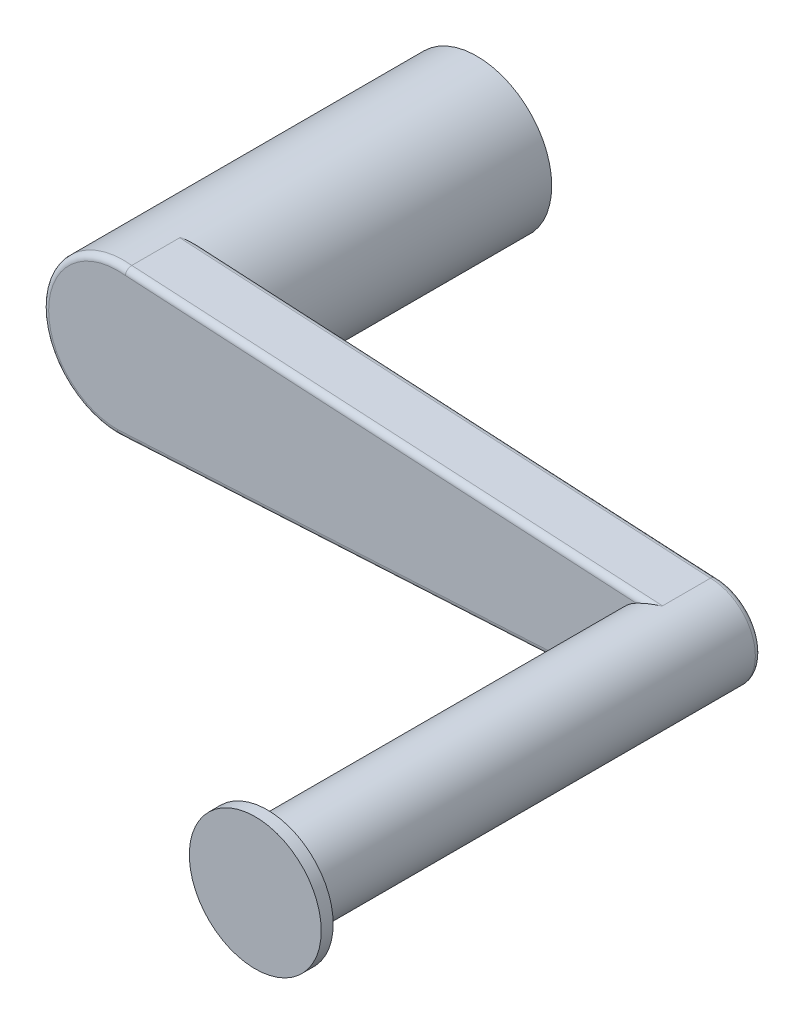
ISO-10303-21;
HEADER;
FILE_DESCRIPTION(('STEP AP214'),'2;1');
FILE_NAME('part.step','',(''),(''),'','','');
FILE_SCHEMA(('AUTOMOTIVE_DESIGN { 1 0 10303 214 1 1 1 1 }'));
ENDSEC;
DATA;
#1=APPLICATION_CONTEXT('core data for automotive mechanical design processes');
#2=APPLICATION_PROTOCOL_DEFINITION('international standard','automotive_design',2000,#1);
#3=PRODUCT_CONTEXT('',#1,'mechanical');
#4=PRODUCT('Part','Part','',(#3));
#5=PRODUCT_RELATED_PRODUCT_CATEGORY('part','',(#4));
#6=PRODUCT_DEFINITION_FORMATION('','',#4);
#7=PRODUCT_DEFINITION_CONTEXT('part definition',#1,'design');
#8=PRODUCT_DEFINITION('design','',#6,#7);
#9=PRODUCT_DEFINITION_SHAPE('','',#8);
#10=(LENGTH_UNIT() NAMED_UNIT(*) SI_UNIT(.MILLI.,.METRE.));
#11=(NAMED_UNIT(*) PLANE_ANGLE_UNIT() SI_UNIT($,.RADIAN.));
#12=(NAMED_UNIT(*) SI_UNIT($,.STERADIAN.) SOLID_ANGLE_UNIT());
#13=UNCERTAINTY_MEASURE_WITH_UNIT(LENGTH_MEASURE(1.E-05),#10,'distance_accuracy_value','');
#14=(GEOMETRIC_REPRESENTATION_CONTEXT(3) GLOBAL_UNCERTAINTY_ASSIGNED_CONTEXT((#13)) GLOBAL_UNIT_ASSIGNED_CONTEXT((#10,
#11,#12)) REPRESENTATION_CONTEXT('',''));
#15=CARTESIAN_POINT('',(0.,0.,0.));
#16=DIRECTION('',(0.,0.,1.));
#17=DIRECTION('',(1.,0.,0.));
#18=AXIS2_PLACEMENT_3D('',#15,#16,#17);
#19=CARTESIAN_POINT('',(0.,0.,100.));
#20=DIRECTION('',(0.,0.,-1.));
#21=DIRECTION('',(-1.,0.,0.));
#22=AXIS2_PLACEMENT_3D('',#19,#20,#21);
#23=CYLINDRICAL_SURFACE('',#22,25.);
#24=DIRECTION('',(0.,0.,-1.));
#25=VECTOR('',#24,1.);
#26=CARTESIAN_POINT('',(1.73255507163184E-13,-25.,120.));
#27=LINE('',#26,#25);
#28=CARTESIAN_POINT('',(1.73255507163184E-13,-25.,118.));
#29=VERTEX_POINT('',#28);
#30=CARTESIAN_POINT('',(1.73255507163184E-13,-25.,100.));
#31=VERTEX_POINT('',#30);
#32=EDGE_CURVE('E117',#29,#31,#27,.T.);
#33=ORIENTED_EDGE('',*,*,#32,.F.);
#34=CARTESIAN_POINT('',(0.,0.,118.));
#35=DIRECTION('',(0.,0.,1.));
#36=DIRECTION('',(1.,0.,0.));
#37=AXIS2_PLACEMENT_3D('',#34,#35,#36);
#38=CIRCLE('',#37,25.);
#39=CARTESIAN_POINT('',(2.7692307692306,24.8461538461539,118.));
#40=VERTEX_POINT('',#39);
#41=EDGE_CURVE('E166',#29,#40,#38,.F.);
#42=ORIENTED_EDGE('',*,*,#41,.T.);
#43=DIRECTION('',(0.,0.,-1.));
#44=VECTOR('',#43,1.);
#45=CARTESIAN_POINT('',(2.7692307692306,24.8461538461539,120.));
#46=LINE('',#45,#44);
#47=CARTESIAN_POINT('',(2.7692307692306,24.8461538461539,102.));
#48=VERTEX_POINT('',#47);
#49=EDGE_CURVE('E126',#40,#48,#46,.T.);
#50=ORIENTED_EDGE('',*,*,#49,.T.);
#51=CARTESIAN_POINT('',(2.7692307692306,24.8461538461539,102.));
#52=CARTESIAN_POINT('',(2.76920657867717,24.8461564574948,101.992857759211));
#53=CARTESIAN_POINT('',(2.76991520750156,24.846077567389,101.985751282102));
#54=CARTESIAN_POINT('',(2.77256276734933,24.8457823079611,101.97188491719));
#55=CARTESIAN_POINT('',(2.77448215644942,24.8455681222639,101.965121334546));
#56=CARTESIAN_POINT('',(2.78014832622034,24.8449347980058,101.949758748725));
#57=CARTESIAN_POINT('',(2.78429358711249,24.8444708433903,101.941312592113));
#58=CARTESIAN_POINT('',(2.79384302701979,24.8433988225037,101.92512709527));
#59=CARTESIAN_POINT('',(2.7992560446564,24.8427897439061,101.917393274576));
#60=CARTESIAN_POINT('',(2.81916410965812,24.8405416408512,101.892045464215));
#61=CARTESIAN_POINT('',(2.8356213982872,24.8386704011619,101.876033411479));
#62=CARTESIAN_POINT('',(2.87049439960146,24.8346649271049,101.846380759646));
#63=CARTESIAN_POINT('',(2.88892127405317,24.8325291816306,101.832754971069));
#64=CARTESIAN_POINT('',(2.94634540055127,24.825803788839,101.79367470635));
#65=CARTESIAN_POINT('',(2.98689660056892,24.8209618884444,101.770571087999));
#66=CARTESIAN_POINT('',(3.06951625726153,24.8108813522948,101.72730993134));
#67=CARTESIAN_POINT('',(3.11158900110526,24.8056415409024,101.70716168297));
#68=CARTESIAN_POINT('',(3.19662461994925,24.7948266110932,101.668659797212));
#69=CARTESIAN_POINT('',(3.23958919681258,24.7892508036696,101.650310065199));
#70=CARTESIAN_POINT('',(3.32590321107761,24.7778179964169,101.614857472116));
#71=CARTESIAN_POINT('',(3.36925195934672,24.7719614397029,101.597752746933));
#72=CARTESIAN_POINT('',(3.49887216629378,24.7540995164109,101.548048991225));
#73=CARTESIAN_POINT('',(3.58556634161329,24.7416941452258,101.516696951772));
#74=CARTESIAN_POINT('',(3.75949821276058,24.7158636866898,101.455973620081));
#75=CARTESIAN_POINT('',(3.84673600661378,24.7024384102401,101.426602697074));
#76=CARTESIAN_POINT('',(4.10904207242345,24.6606391854036,101.340463958842));
#77=CARTESIAN_POINT('',(4.28454023665348,24.6307642082866,101.28572905875));
#78=CARTESIAN_POINT('',(4.6352359152364,24.5671787724438,101.179776125138));
#79=CARTESIAN_POINT('',(4.81043251503152,24.5334812750937,101.128547098498));
#80=CARTESIAN_POINT('',(5.16076636724421,24.462183766347,101.028826845169));
#81=CARTESIAN_POINT('',(5.33590362417317,24.4245846291087,100.980335008959));
#82=CARTESIAN_POINT('',(5.74914689913024,24.3311929748444,100.868827482744));
#83=CARTESIAN_POINT('',(5.98716803800244,24.2737315528299,100.806885778224));
#84=CARTESIAN_POINT('',(6.46256018223369,24.1515125585137,100.687823103982));
#85=CARTESIAN_POINT('',(6.69993114278511,24.0867544957022,100.630702458803));
#86=CARTESIAN_POINT('',(7.17377802701009,23.9499001949842,100.521824878269));
#87=CARTESIAN_POINT('',(7.41025399927979,23.87780436161,100.470067647546));
#88=CARTESIAN_POINT('',(7.88211933800289,23.7262219146774,100.372695403057));
#89=CARTESIAN_POINT('',(8.11750865455208,23.6467349651605,100.327080668727));
#90=CARTESIAN_POINT('',(8.58853894443721,23.479775370185,100.242729365072));
#91=CARTESIAN_POINT('',(8.82417087041999,23.392252393064,100.204041355719));
#92=CARTESIAN_POINT('',(9.2937273750626,23.2096978147144,100.135238956439));
#93=CARTESIAN_POINT('',(9.52765229885457,23.1146677799959,100.105122783819));
#94=CARTESIAN_POINT('',(9.99387609863133,22.9169510177687,100.055048837454));
#95=CARTESIAN_POINT('',(10.2261714361869,22.8142512527008,100.035108834184));
#96=CARTESIAN_POINT('',(10.572708317773,22.6546691807796,100.014470872828));
#97=CARTESIAN_POINT('',(10.687948651342,22.6005303158732,100.00913661657));
#98=CARTESIAN_POINT('',(10.9176923899179,22.4904474424139,100.001904840764));
#99=CARTESIAN_POINT('',(11.0321956799994,22.4345031601516,100.000007844834));
#100=CARTESIAN_POINT('',(11.1462780521516,22.3776782885116,100.));
#101=B_SPLINE_CURVE_WITH_KNOTS('',3,(#51,#52,#53,#54,#55,#56,#57,#58,#59,#60,#61,#62,#63,#64,
#65,#66,#67,#68,#69,#70,#71,#72,#73,#74,#75,#76,#77,#78,#79,#80,#81,#82,#83,#84,#85,#86,#87,#88,
#89,#90,#91,#92,#93,#94,#95,#96,#97,#98,#99,#100),.UNSPECIFIED.,.F.,.F.,(4,2,2,2,2,2,2,2,2,2,2,
2,2,2,2,2,2,2,2,2,2,2,2,2,4),(0.,0.021333819773158,0.0423318212837777,0.070431134939626,
0.0987325129778903,0.16730903729403,0.236297164248191,0.376676475589857,0.51748801158423,
0.658598835264423,0.799493835856999,1.07849743855035,1.35755289764912,1.91618712729434,
2.47298078042137,3.02964995278515,3.78721125241906,4.54482350881382,5.30239402053456,
6.05999898398725,6.82272324361543,7.58528876262812,8.34918141907269,8.73143375787859,
9.11374432267093),.UNSPECIFIED.);
#102=CARTESIAN_POINT('',(11.1462780521516,22.3776782885116,100.));
#103=VERTEX_POINT('',#102);
#104=EDGE_CURVE('E176',#48,#103,#101,.T.);
#105=ORIENTED_EDGE('',*,*,#104,.T.);
#106=CARTESIAN_POINT('',(0.,0.,100.));
#107=DIRECTION('',(0.,0.,1.));
#108=DIRECTION('',(1.,0.,0.));
#109=AXIS2_PLACEMENT_3D('',#106,#107,#108);
#110=CIRCLE('',#109,25.);
#111=CARTESIAN_POINT('',(11.1462780521516,-22.3776782885116,100.));
#112=VERTEX_POINT('',#111);
#113=EDGE_CURVE('E135',#112,#103,#110,.T.);
#114=ORIENTED_EDGE('',*,*,#113,.F.);
#115=CARTESIAN_POINT('',(11.1462780521516,-22.3776782885116,100.));
#116=CARTESIAN_POINT('',(10.9947202180078,-22.4531717665944,100.000026667264));
#117=CARTESIAN_POINT('',(10.8424204076504,-22.5271075935094,100.003362510792));
#118=CARTESIAN_POINT('',(10.5365917606414,-22.6717622898329,100.015907212167));
#119=CARTESIAN_POINT('',(10.3830633078832,-22.7424821212264,100.025114301232));
#120=CARTESIAN_POINT('',(10.0751091711026,-22.8805732217772,100.048644200778));
#121=CARTESIAN_POINT('',(9.92068465121186,-22.9479480665448,100.062961408589));
#122=CARTESIAN_POINT('',(9.61091469636479,-23.0793984453543,100.096130313536));
#123=CARTESIAN_POINT('',(9.45556918647434,-23.1434737067087,100.11498238472));
#124=CARTESIAN_POINT('',(8.98957797901295,-23.33022021875,100.177397291582));
#125=CARTESIAN_POINT('',(8.67773877064538,-23.4479670644093,100.226922029897));
#126=CARTESIAN_POINT('',(8.05164569395838,-23.6702639661179,100.338715442346));
#127=CARTESIAN_POINT('',(7.7373914525556,-23.7748119378383,100.400986125223));
#128=CARTESIAN_POINT('',(7.29271842022442,-23.9130646391879,100.496206522508));
#129=CARTESIAN_POINT('',(7.16303512876695,-23.9522280648586,100.524824890304));
#130=CARTESIAN_POINT('',(6.90341473003312,-24.0283407976547,100.583702858056));
#131=CARTESIAN_POINT('',(6.77347766688375,-24.0652904595015,100.613962193584));
#132=CARTESIAN_POINT('',(6.38326772651228,-24.1728505954561,100.707050102354));
#133=CARTESIAN_POINT('',(6.12262359757118,-24.240163678049,100.772182644398));
#134=CARTESIAN_POINT('',(5.68409785939289,-24.3459318970926,100.886360787478));
#135=CARTESIAN_POINT('',(5.50638141486657,-24.3867356130519,100.93389706288));
#136=CARTESIAN_POINT('',(5.1508004883222,-24.4643081207588,101.031626931557));
#137=CARTESIAN_POINT('',(4.97293600900382,-24.5010769845316,101.081820477374));
#138=CARTESIAN_POINT('',(4.55645764836503,-24.582468862979,101.202765415812));
#139=CARTESIAN_POINT('',(4.31786171001274,-24.6254800625109,101.27467890286));
#140=CARTESIAN_POINT('',(3.92142070918776,-24.6910560164698,101.401335865556));
#141=CARTESIAN_POINT('',(3.76319909126605,-24.7156541029645,101.453800606685));
#142=CARTESIAN_POINT('',(3.5013377242631,-24.7538245272338,101.54708505221));
#143=CARTESIAN_POINT('',(3.39713352453321,-24.7683337795977,101.585934428306));
#144=CARTESIAN_POINT('',(3.22510295055215,-24.791198200186,101.656061661291));
#145=CARTESIAN_POINT('',(3.15667095312411,-24.7999987394655,101.685578901661));
#146=CARTESIAN_POINT('',(3.04446024611788,-24.8139753169922,101.73992467454));
#147=CARTESIAN_POINT('',(2.9999043180747,-24.8193990241249,101.763154184527));
#148=CARTESIAN_POINT('',(2.91491039342431,-24.8295181542456,101.813676976061));
#149=CARTESIAN_POINT('',(2.87437876168512,-24.8342341436968,101.840768245965));
#150=CARTESIAN_POINT('',(2.83142763938051,-24.8391441447815,101.880725273106));
#151=CARTESIAN_POINT('',(2.82411427979151,-24.8399764275545,101.888011054744));
#152=CARTESIAN_POINT('',(2.81025661381319,-24.841547951551,101.903318693957));
#153=CARTESIAN_POINT('',(2.8037130370724,-24.8422871045466,101.911341237261));
#154=CARTESIAN_POINT('',(2.7927788518653,-24.8435185075955,101.926867809449));
#155=CARTESIAN_POINT('',(2.7882111650779,-24.8440313645097,101.934243121044));
#156=CARTESIAN_POINT('',(2.78030497442223,-24.8449173867796,101.949609208574));
#157=CARTESIAN_POINT('',(2.77695975876878,-24.8452913150959,101.957596323441));
#158=CARTESIAN_POINT('',(2.77277116324634,-24.8457590578176,101.971343637694));
#159=CARTESIAN_POINT('',(2.77146563764106,-24.8459046835804,101.976959919337));
#160=CARTESIAN_POINT('',(2.76968533843292,-24.8461031834249,101.988378318942));
#161=CARTESIAN_POINT('',(2.76921878370178,-24.8461551398998,101.99418171446));
#162=CARTESIAN_POINT('',(2.76923076923055,-24.8461538461539,102.));
#163=B_SPLINE_CURVE_WITH_KNOTS('',3,(#115,#116,#117,#118,#119,#120,#121,#122,#123,#124,#125,
#126,#127,#128,#129,#130,#131,#132,#133,#134,#135,#136,#137,#138,#139,#140,#141,#142,#143,#144,
#145,#146,#147,#148,#149,#150,#151,#152,#153,#154,#155,#156,#157,#158,#159,#160,#161,#162),
.UNSPECIFIED.,.F.,.F.,(4,2,2,2,2,2,2,2,2,2,2,2,2,2,2,2,2,2,2,2,2,2,2,4),(0.,0.507873369306865,
1.01559380797366,1.52275928956754,2.029966617801,3.04030487823401,4.05080248938296,
4.46615396830147,4.88143871460736,5.71209634770178,6.27734724956502,6.84258805962413,
7.60105300373672,8.1064085668873,8.44282400762927,8.66769313393147,8.81940083716782,
8.96498156683116,8.99601095589755,9.02706952354752,9.05306429788509,9.07891412803654,
9.09615765839128,9.11356921112331),.UNSPECIFIED.);
#164=CARTESIAN_POINT('',(2.76923076923068,-24.8461538461539,102.));
#165=VERTEX_POINT('',#164);
#166=EDGE_CURVE('E168',#112,#165,#163,.T.);
#167=ORIENTED_EDGE('',*,*,#166,.T.);
#168=DIRECTION('',(0.,0.,-1.));
#169=VECTOR('',#168,1.);
#170=CARTESIAN_POINT('',(2.7692307692306,-24.8461538461539,100.));
#171=LINE('',#170,#169);
#172=CARTESIAN_POINT('',(2.7692307692306,-24.8461538461539,100.));
#173=VERTEX_POINT('',#172);
#174=EDGE_CURVE('E61',#173,#165,#171,.F.);
#175=ORIENTED_EDGE('',*,*,#174,.F.);
#176=EDGE_CURVE('E130',#31,#173,#110,.T.);
#177=ORIENTED_EDGE('',*,*,#176,.F.);
#178=EDGE_LOOP('',(#33,#42,#50,#105,#114,#167,#175,#177));
#179=FACE_BOUND('',#178,.T.);
#180=CARTESIAN_POINT('',(0.,0.,0.));
#181=DIRECTION('',(0.,0.,1.));
#182=DIRECTION('',(1.,0.,0.));
#183=AXIS2_PLACEMENT_3D('',#180,#181,#182);
#184=CIRCLE('',#183,25.);
#185=CARTESIAN_POINT('',(25.,0.,0.));
#186=VERTEX_POINT('',#185);
#187=EDGE_CURVE('E141',#186,#186,#184,.T.);
#188=ORIENTED_EDGE('',*,*,#187,.T.);
#189=EDGE_LOOP('',(#188));
#190=FACE_BOUND('',#189,.T.);
#191=ADVANCED_FACE('F38',(#179,#190),#23,.T.);
#192=CARTESIAN_POINT('',(0.,0.,100.));
#193=DIRECTION('',(0.,0.,1.));
#194=DIRECTION('',(1.,0.,0.));
#195=AXIS2_PLACEMENT_3D('',#192,#193,#194);
#196=PLANE('',#195);
#197=DIRECTION('',(0.998460353205413,0.0554700196225229,0.));
#198=VECTOR('',#197,1.);
#199=CARTESIAN_POINT('',(1.38461538461539,-24.9230769230769,100.));
#200=LINE('',#199,#198);
#201=EDGE_CURVE('E120',#31,#173,#200,.T.);
#202=ORIENTED_EDGE('',*,*,#201,.F.);
#203=ORIENTED_EDGE('',*,*,#176,.T.);
#204=EDGE_LOOP('',(#202,#203));
#205=FACE_BOUND('',#204,.T.);
#206=ADVANCED_FACE('F129',(#205),#196,.T.);
#207=CARTESIAN_POINT('',(0.,0.,0.));
#208=DIRECTION('',(0.,0.,1.));
#209=DIRECTION('',(1.,0.,0.));
#210=AXIS2_PLACEMENT_3D('',#207,#208,#209);
#211=PLANE('',#210);
#212=ORIENTED_EDGE('',*,*,#187,.F.);
#213=EDGE_LOOP('',(#212));
#214=FACE_BOUND('',#213,.T.);
#215=ADVANCED_FACE('F230',(#214),#211,.F.);
#216=CARTESIAN_POINT('',(0.,0.,100.));
#217=DIRECTION('',(0.,0.,1.));
#218=DIRECTION('',(1.,0.,0.));
#219=AXIS2_PLACEMENT_3D('',#216,#217,#218);
#220=PLANE('',#219);
#221=CARTESIAN_POINT('',(180.,0.,100.));
#222=DIRECTION('',(0.,0.,1.));
#223=DIRECTION('',(1.,0.,0.));
#224=AXIS2_PLACEMENT_3D('',#221,#222,#223);
#225=CIRCLE('',#224,13.);
#226=CARTESIAN_POINT('',(179.946470963011,12.9998897934639,100.));
#227=VERTEX_POINT('',#226);
#228=CARTESIAN_POINT('',(179.946470963011,-12.9998897934636,100.));
#229=VERTEX_POINT('',#228);
#230=EDGE_CURVE('E149',#227,#229,#225,.F.);
#231=ORIENTED_EDGE('',*,*,#230,.T.);
#232=DIRECTION('',(0.998460353205412,0.0554700196225229,0.));
#233=VECTOR('',#232,1.);
#234=CARTESIAN_POINT('',(1.27367534537034,-22.9261562166661,100.));
#235=LINE('',#234,#233);
#236=EDGE_CURVE('E151',#229,#112,#235,.F.);
#237=ORIENTED_EDGE('',*,*,#236,.T.);
#238=ORIENTED_EDGE('',*,*,#113,.T.);
#239=DIRECTION('',(0.998460353205412,-0.0554700196225229,0.));
#240=VECTOR('',#239,1.);
#241=CARTESIAN_POINT('',(179.889059960755,13.0030792935892,100.));
#242=LINE('',#241,#240);
#243=EDGE_CURVE('E138',#103,#227,#242,.T.);
#244=ORIENTED_EDGE('',*,*,#243,.T.);
#245=EDGE_LOOP('',(#231,#237,#238,#244));
#246=FACE_BOUND('',#245,.T.);
#247=ADVANCED_FACE('F235',(#246),#220,.F.);
#248=CARTESIAN_POINT('',(1.38461538461539,-24.9230769230769,120.));
#249=DIRECTION('',(-0.0554700196225229,0.998460353205412,0.));
#250=DIRECTION('',(-0.998460353205412,-0.0554700196225229,0.));
#251=AXIS2_PLACEMENT_3D('',#248,#249,#250);
#252=PLANE('',#251);
#253=ORIENTED_EDGE('',*,*,#174,.T.);
#254=DIRECTION('',(0.998460353205412,0.0554700196225229,0.));
#255=VECTOR('',#254,1.);
#256=CARTESIAN_POINT('',(1.38461538461539,-24.9230769230769,102.));
#257=LINE('',#256,#255);
#258=CARTESIAN_POINT('',(180.,-15.,102.));
#259=VERTEX_POINT('',#258);
#260=EDGE_CURVE('E155',#165,#259,#257,.T.);
#261=ORIENTED_EDGE('',*,*,#260,.T.);
#262=DIRECTION('',(0.,0.,-1.));
#263=VECTOR('',#262,1.);
#264=CARTESIAN_POINT('',(180.,-15.,120.));
#265=LINE('',#264,#263);
#266=CARTESIAN_POINT('',(180.,-15.,118.));
#267=VERTEX_POINT('',#266);
#268=EDGE_CURVE('E144',#267,#259,#265,.T.);
#269=ORIENTED_EDGE('',*,*,#268,.F.);
#270=DIRECTION('',(0.998460353205412,0.0554700196225229,0.));
#271=VECTOR('',#270,1.);
#272=CARTESIAN_POINT('',(1.72333935316571E-13,-25.,118.));
#273=LINE('',#272,#271);
#274=EDGE_CURVE('E124',#267,#29,#273,.F.);
#275=ORIENTED_EDGE('',*,*,#274,.T.);
#276=ORIENTED_EDGE('',*,*,#32,.T.);
#277=ORIENTED_EDGE('',*,*,#201,.T.);
#278=EDGE_LOOP('',(#253,#261,#269,#275,#276,#277));
#279=FACE_BOUND('',#278,.T.);
#280=ADVANCED_FACE('F119',(#279),#252,.F.);
#281=CARTESIAN_POINT('',(180.,0.,120.));
#282=DIRECTION('',(0.,0.,-1.));
#283=DIRECTION('',(-1.,0.,0.));
#284=AXIS2_PLACEMENT_3D('',#281,#282,#283);
#285=CYLINDRICAL_SURFACE('',#284,15.);
#286=ORIENTED_EDGE('',*,*,#268,.T.);
#287=CARTESIAN_POINT('',(180.,0.,102.));
#288=DIRECTION('',(0.,0.,1.));
#289=DIRECTION('',(1.,0.,0.));
#290=AXIS2_PLACEMENT_3D('',#287,#288,#289);
#291=CIRCLE('',#290,15.);
#292=CARTESIAN_POINT('',(180.,15.,102.));
#293=VERTEX_POINT('',#292);
#294=EDGE_CURVE('E134',#259,#293,#291,.T.);
#295=ORIENTED_EDGE('',*,*,#294,.T.);
#296=DIRECTION('',(0.,0.,-1.));
#297=VECTOR('',#296,1.);
#298=CARTESIAN_POINT('',(180.,15.,120.));
#299=LINE('',#298,#297);
#300=CARTESIAN_POINT('',(180.,15.,118.));
#301=VERTEX_POINT('',#300);
#302=EDGE_CURVE('E282',#301,#293,#299,.T.);
#303=ORIENTED_EDGE('',*,*,#302,.F.);
#304=CARTESIAN_POINT('',(180.,15.,118.));
#305=CARTESIAN_POINT('',(180.000026097499,14.9999998543214,118.007247512939));
#306=CARTESIAN_POINT('',(179.999290882118,15.000000010069,118.014455599069));
#307=CARTESIAN_POINT('',(179.99655480201,14.9999997017644,118.028507545098));
#308=CARTESIAN_POINT('',(179.994575427314,14.9999992480902,118.035355491439));
#309=CARTESIAN_POINT('',(179.988707023759,14.9999960991971,118.051021652811));
#310=CARTESIAN_POINT('',(179.984389198275,14.9999926641829,118.059674457915));
#311=CARTESIAN_POINT('',(179.974465354984,14.9999791204346,118.07626210155));
#312=CARTESIAN_POINT('',(179.968849501747,14.9999689595821,118.084190778394));
#313=CARTESIAN_POINT('',(179.947180338327,14.999914914165,118.111573490726));
#314=CARTESIAN_POINT('',(179.928817865881,14.9998430812062,118.129144624079));
#315=CARTESIAN_POINT('',(179.890028648535,14.9996099740568,118.161793816624));
#316=CARTESIAN_POINT('',(179.869589413548,14.9994481288905,118.176855154547));
#317=CARTESIAN_POINT('',(179.802603216456,14.9987708614652,118.222660189905));
#318=CARTESIAN_POINT('',(179.754129380157,14.998064158244,118.250561242417));
#319=CARTESIAN_POINT('',(179.655575613009,14.9961278139815,118.303384946998));
#320=CARTESIAN_POINT('',(179.605491398279,14.9948966490883,118.328298646685));
#321=CARTESIAN_POINT('',(179.504444396653,14.9918968724078,118.376364884023));
#322=CARTESIAN_POINT('',(179.453481099091,14.9901279375782,118.399516352608));
#323=CARTESIAN_POINT('',(179.351163087,14.9860480104118,118.44465980052));
#324=CARTESIAN_POINT('',(179.299809020832,14.983737780925,118.46665335876));
#325=CARTESIAN_POINT('',(179.145715769266,14.9760053969878,118.531288463811));
#326=CARTESIAN_POINT('',(179.042530103852,14.9697693897763,118.572773446818));
#327=CARTESIAN_POINT('',(178.835573183411,14.9550957618857,118.653858216713));
#328=CARTESIAN_POINT('',(178.731801848333,14.9466578327378,118.693457738546));
#329=CARTESIAN_POINT('',(178.419824669577,14.9179980616782,118.810180553512));
#330=CARTESIAN_POINT('',(178.211112427127,14.8944379860304,118.885164734756));
#331=CARTESIAN_POINT('',(177.793819566729,14.8383626178507,119.03020130117));
#332=CARTESIAN_POINT('',(177.585240069345,14.8058712564145,119.100266246161));
#333=CARTESIAN_POINT('',(177.168053557567,14.7317669740623,119.235315908143));
#334=CARTESIAN_POINT('',(176.959446543011,14.6901539968231,119.300300593761));
#335=CARTESIAN_POINT('',(176.452522032444,14.5776840810557,119.45122189448));
#336=CARTESIAN_POINT('',(176.154349128914,14.5019573958868,119.534094311121));
#337=CARTESIAN_POINT('',(175.559725361069,14.3310694747959,119.684354074815));
#338=CARTESIAN_POINT('',(175.263273670256,14.2359185268126,119.751749579129));
#339=CARTESIAN_POINT('',(174.81959114619,14.0779375867166,119.837741546177));
#340=CARTESIAN_POINT('',(174.671192254825,14.0224480364028,119.863972716914));
#341=CARTESIAN_POINT('',(174.375429313353,13.9064527821458,119.910372959163));
#342=CARTESIAN_POINT('',(174.228065047567,13.845948159485,119.930543333108));
#343=CARTESIAN_POINT('',(173.93425108122,13.7197776723406,119.963905068725));
#344=CARTESIAN_POINT('',(173.787805015558,13.6540980568916,119.977077063376));
#345=CARTESIAN_POINT('',(173.496573702813,13.5178171413994,119.995103874508));
#346=CARTESIAN_POINT('',(173.351789847799,13.4472120231934,119.999952162342));
#347=CARTESIAN_POINT('',(173.208119981411,13.3742426257749,120.));
#348=B_SPLINE_CURVE_WITH_KNOTS('',3,(#304,#305,#306,#307,#308,#309,#310,#311,#312,#313,#314,
#315,#316,#317,#318,#319,#320,#321,#322,#323,#324,#325,#326,#327,#328,#329,#330,#331,#332,#333,
#334,#335,#336,#337,#338,#339,#340,#341,#342,#343,#344,#345,#346,#347),.UNSPECIFIED.,.F.,.F.,(4,
2,2,2,2,2,2,2,2,2,2,2,2,2,2,2,2,2,2,2,2,4),(0.,0.0216421767533144,0.0429204359594343,
0.0717660170293675,0.100837780543937,0.176479028916941,0.252605658019078,0.419984265841013,
0.587852554565316,0.755821882907959,0.923555899915129,1.25765505621464,1.59180104183324,
2.26060030300656,2.92762471828209,3.59465325235155,4.5496054171725,5.50405310375202,
5.98566452082102,6.46717236808614,6.95000586945929,7.43321790553074),.UNSPECIFIED.);
#349=CARTESIAN_POINT('',(173.208119981411,13.3742426257749,120.));
#350=VERTEX_POINT('',#349);
#351=EDGE_CURVE('E11',#301,#350,#348,.T.);
#352=ORIENTED_EDGE('',*,*,#351,.T.);
#353=CARTESIAN_POINT('',(180.,0.,120.));
#354=DIRECTION('',(0.,0.,1.));
#355=DIRECTION('',(1.,0.,0.));
#356=AXIS2_PLACEMENT_3D('',#353,#354,#355);
#357=CIRCLE('',#356,15.);
#358=CARTESIAN_POINT('',(173.208119981411,-13.3742426257749,120.));
#359=VERTEX_POINT('',#358);
#360=EDGE_CURVE('E288',#350,#359,#357,.T.);
#361=ORIENTED_EDGE('',*,*,#360,.T.);
#362=CARTESIAN_POINT('',(173.208119981411,-13.3742426257749,120.));
#363=CARTESIAN_POINT('',(173.31877379846,-13.430439929404,119.999982265063));
#364=CARTESIAN_POINT('',(173.430101457113,-13.4852447963539,119.997094747276));
#365=CARTESIAN_POINT('',(173.653832248435,-13.5919639132338,119.986194002678));
#366=CARTESIAN_POINT('',(173.76623490559,-13.6438793777194,119.978182947499));
#367=CARTESIAN_POINT('',(173.991747697587,-13.7446768104438,119.95766521137));
#368=CARTESIAN_POINT('',(174.104856323564,-13.793563736483,119.945166118419));
#369=CARTESIAN_POINT('',(174.331809207967,-13.8883671205073,119.916167054772));
#370=CARTESIAN_POINT('',(174.445653551415,-13.9342832281715,119.899666613318));
#371=CARTESIAN_POINT('',(174.786698936425,-14.0670093210106,119.845056109061));
#372=CARTESIAN_POINT('',(175.014796587974,-14.1494145252496,119.801699723442));
#373=CARTESIAN_POINT('',(175.472524549584,-14.3024560790558,119.703762808537));
#374=CARTESIAN_POINT('',(175.702155288383,-14.3730889796084,119.649179000302));
#375=CARTESIAN_POINT('',(176.159893865099,-14.5020519328375,119.531566569654));
#376=CARTESIAN_POINT('',(176.387991935368,-14.5605048108917,119.468633907787));
#377=CARTESIAN_POINT('',(176.844669815868,-14.6662489096109,119.335452794582));
#378=CARTESIAN_POINT('',(177.073249729944,-14.713537406928,119.265202564267));
#379=CARTESIAN_POINT('',(177.617565902996,-14.8130670385375,119.090647884245));
#380=CARTESIAN_POINT('',(177.933336635461,-14.8603338235875,118.983564402405));
#381=CARTESIAN_POINT('',(178.460384408153,-14.9223039403192,118.795269644563));
#382=CARTESIAN_POINT('',(178.672092283401,-14.9426008996929,118.717037037378));
#383=CARTESIAN_POINT('',(179.022485206334,-14.9687700083496,118.58104138927));
#384=CARTESIAN_POINT('',(179.161742947827,-14.9771981333374,118.525261452402));
#385=CARTESIAN_POINT('',(179.390975857675,-14.9879083283715,118.427693468083));
#386=CARTESIAN_POINT('',(179.48160182581,-14.9913058303043,118.387600070685));
#387=CARTESIAN_POINT('',(179.630067240972,-14.9955543111092,118.316304692815));
#388=CARTESIAN_POINT('',(179.688636405806,-14.9968778587411,118.286676982167));
#389=CARTESIAN_POINT('',(179.784105291275,-14.998494624521,118.232841728685));
#390=CARTESIAN_POINT('',(179.821766970161,-14.9989838157831,118.210080947388));
#391=CARTESIAN_POINT('',(179.876024419542,-14.9994990025539,118.172091166463));
#392=CARTESIAN_POINT('',(179.893868862603,-14.9996344756672,118.158665368904));
#393=CARTESIAN_POINT('',(179.927881056158,-14.999835969376,118.129816287415));
#394=CARTESIAN_POINT('',(179.944055922355,-14.9999022967027,118.114402169025));
#395=CARTESIAN_POINT('',(179.963949787011,-14.9999577993889,118.090595393674));
#396=CARTESIAN_POINT('',(179.969291360609,-14.9999693773006,118.08358495837));
#397=CARTESIAN_POINT('',(179.979062512567,-14.9999861673103,118.068944138035));
#398=CARTESIAN_POINT('',(179.983492891077,-14.9999913850134,118.061314305201));
#399=CARTESIAN_POINT('',(179.990274171515,-14.9999971539425,118.047005033107));
#400=CARTESIAN_POINT('',(179.992863779877,-14.9999984299764,118.040440888278));
#401=CARTESIAN_POINT('',(179.996922736548,-14.9999998314918,118.026982440508));
#402=CARTESIAN_POINT('',(179.998395615698,-14.9999999606135,118.02008925203));
#403=CARTESIAN_POINT('',(179.999742056124,-14.9999999920093,118.008769161886));
#404=CARTESIAN_POINT('',(180.00000811774,-14.999999961162,118.004386101033));
#405=CARTESIAN_POINT('',(180.,-15.,118.));
#406=B_SPLINE_CURVE_WITH_KNOTS('',3,(#362,#363,#364,#365,#366,#367,#368,#369,#370,#371,#372,
#373,#374,#375,#376,#377,#378,#379,#380,#381,#382,#383,#384,#385,#386,#387,#388,#389,#390,#391,
#392,#393,#394,#395,#396,#397,#398,#399,#400,#401,#402,#403,#404,#405),.UNSPECIFIED.,.F.,.F.,(4,
2,2,2,2,2,2,2,2,2,2,2,2,2,2,2,2,2,2,2,2,4),(0.,0.372233643916363,0.744309619575161,
1.11575945954073,1.48725302157966,2.22568677759937,2.96433649889354,3.69513249960413,
4.42610658096911,5.43550789048681,6.1150968449347,6.56573704283441,6.86308934891259,
7.05995064065687,7.1917230865852,7.25866993525486,7.32531852699383,7.35171213159104,
7.37808245921303,7.39917646545518,7.42020349595541,7.43335049719513),.UNSPECIFIED.);
#407=EDGE_CURVE('E53',#359,#267,#406,.T.);
#408=ORIENTED_EDGE('',*,*,#407,.T.);
#409=EDGE_LOOP('',(#286,#295,#303,#352,#361,#408));
#410=FACE_BOUND('',#409,.T.);
#411=CARTESIAN_POINT('',(180.,0.,250.));
#412=DIRECTION('',(0.,0.,1.));
#413=DIRECTION('',(1.,0.,0.));
#414=AXIS2_PLACEMENT_3D('',#411,#412,#413);
#415=CIRCLE('',#414,15.);
#416=CARTESIAN_POINT('',(195.,0.,250.));
#417=VERTEX_POINT('',#416);
#418=EDGE_CURVE('E131',#417,#417,#415,.T.);
#419=ORIENTED_EDGE('',*,*,#418,.F.);
#420=EDGE_LOOP('',(#419));
#421=FACE_BOUND('',#420,.T.);
#422=ADVANCED_FACE('F240',(#410,#421),#285,.T.);
#423=CARTESIAN_POINT('',(1.38461538461539,24.9230769230769,120.));
#424=DIRECTION('',(0.0554700196225229,0.998460353205412,0.));
#425=DIRECTION('',(-0.998460353205412,0.0554700196225229,0.));
#426=AXIS2_PLACEMENT_3D('',#423,#424,#425);
#427=PLANE('',#426);
#428=ORIENTED_EDGE('',*,*,#302,.T.);
#429=DIRECTION('',(0.998460353205412,-0.0554700196225229,0.));
#430=VECTOR('',#429,1.);
#431=CARTESIAN_POINT('',(2.7692307692306,24.8461538461539,102.));
#432=LINE('',#431,#430);
#433=EDGE_CURVE('E159',#293,#48,#432,.F.);
#434=ORIENTED_EDGE('',*,*,#433,.T.);
#435=ORIENTED_EDGE('',*,*,#49,.F.);
#436=DIRECTION('',(0.998460353205412,-0.0554700196225229,0.));
#437=VECTOR('',#436,1.);
#438=CARTESIAN_POINT('',(1.38461538461539,24.9230769230769,118.));
#439=LINE('',#438,#437);
#440=EDGE_CURVE('E157',#40,#301,#439,.T.);
#441=ORIENTED_EDGE('',*,*,#440,.T.);
#442=EDGE_LOOP('',(#428,#434,#435,#441));
#443=FACE_BOUND('',#442,.T.);
#444=ADVANCED_FACE('F244',(#443),#427,.T.);
#445=CARTESIAN_POINT('',(0.,0.,120.));
#446=DIRECTION('',(0.,0.,1.));
#447=DIRECTION('',(1.,0.,0.));
#448=AXIS2_PLACEMENT_3D('',#445,#446,#447);
#449=PLANE('',#448);
#450=CARTESIAN_POINT('',(0.,0.,120.));
#451=DIRECTION('',(0.,0.,1.));
#452=DIRECTION('',(1.,0.,0.));
#453=AXIS2_PLACEMENT_3D('',#450,#451,#452);
#454=CIRCLE('',#453,23.);
#455=CARTESIAN_POINT('',(2.60170728072809,22.8523766647018,120.));
#456=VERTEX_POINT('',#455);
#457=CARTESIAN_POINT('',(-0.054356589987322,-22.9999357686304,120.));
#458=VERTEX_POINT('',#457);
#459=EDGE_CURVE('E69',#456,#458,#454,.T.);
#460=ORIENTED_EDGE('',*,*,#459,.T.);
#461=DIRECTION('',(0.998460353205412,0.0554700196225229,0.));
#462=VECTOR('',#461,1.);
#463=CARTESIAN_POINT('',(179.889059960755,-13.0030792935892,120.));
#464=LINE('',#463,#462);
#465=EDGE_CURVE('E164',#458,#359,#464,.T.);
#466=ORIENTED_EDGE('',*,*,#465,.T.);
#467=ORIENTED_EDGE('',*,*,#360,.F.);
#468=DIRECTION('',(0.998460353205412,-0.0554700196225229,0.));
#469=VECTOR('',#468,1.);
#470=CARTESIAN_POINT('',(1.27367534537034,22.9261562166661,120.));
#471=LINE('',#470,#469);
#472=EDGE_CURVE('E161',#350,#456,#471,.F.);
#473=ORIENTED_EDGE('',*,*,#472,.T.);
#474=EDGE_LOOP('',(#460,#466,#467,#473));
#475=FACE_BOUND('',#474,.T.);
#476=ADVANCED_FACE('F304',(#475),#449,.T.);
#477=CARTESIAN_POINT('',(180.,0.,254.));
#478=DIRECTION('',(0.,0.,-1.));
#479=DIRECTION('',(-1.,0.,0.));
#480=AXIS2_PLACEMENT_3D('',#477,#478,#479);
#481=CYLINDRICAL_SURFACE('',#480,22.025336864466);
#482=CARTESIAN_POINT('',(180.,0.,254.));
#483=DIRECTION('',(0.,0.,1.));
#484=DIRECTION('',(1.,0.,0.));
#485=AXIS2_PLACEMENT_3D('',#482,#483,#484);
#486=CIRCLE('',#485,22.025336864466);
#487=CARTESIAN_POINT('',(202.025336864466,0.,254.));
#488=VERTEX_POINT('',#487);
#489=EDGE_CURVE('E291',#488,#488,#486,.T.);
#490=ORIENTED_EDGE('',*,*,#489,.F.);
#491=EDGE_LOOP('',(#490));
#492=FACE_BOUND('',#491,.T.);
#493=CARTESIAN_POINT('',(180.,0.,250.));
#494=DIRECTION('',(0.,0.,1.));
#495=DIRECTION('',(1.,0.,0.));
#496=AXIS2_PLACEMENT_3D('',#493,#494,#495);
#497=CIRCLE('',#496,22.025336864466);
#498=CARTESIAN_POINT('',(202.025336864466,0.,250.));
#499=VERTEX_POINT('',#498);
#500=EDGE_CURVE('E204',#499,#499,#497,.T.);
#501=ORIENTED_EDGE('',*,*,#500,.T.);
#502=EDGE_LOOP('',(#501));
#503=FACE_BOUND('',#502,.T.);
#504=ADVANCED_FACE('F301',(#492,#503),#481,.T.);
#505=CARTESIAN_POINT('',(180.,0.,254.));
#506=DIRECTION('',(0.,0.,1.));
#507=DIRECTION('',(1.,0.,0.));
#508=AXIS2_PLACEMENT_3D('',#505,#506,#507);
#509=PLANE('',#508);
#510=ORIENTED_EDGE('',*,*,#489,.T.);
#511=EDGE_LOOP('',(#510));
#512=FACE_BOUND('',#511,.T.);
#513=ADVANCED_FACE('F299',(#512),#509,.T.);
#514=CARTESIAN_POINT('',(180.,0.,250.));
#515=DIRECTION('',(0.,0.,1.));
#516=DIRECTION('',(1.,0.,0.));
#517=AXIS2_PLACEMENT_3D('',#514,#515,#516);
#518=PLANE('',#517);
#519=ORIENTED_EDGE('',*,*,#418,.T.);
#520=EDGE_LOOP('',(#519));
#521=FACE_BOUND('',#520,.T.);
#522=ORIENTED_EDGE('',*,*,#500,.F.);
#523=EDGE_LOOP('',(#522));
#524=FACE_BOUND('',#523,.T.);
#525=ADVANCED_FACE('F190',(#521,#524),#518,.F.);
#526=CARTESIAN_POINT('',(1.27367534537034,-22.9261562166661,102.));
#527=DIRECTION('',(0.998460353205412,0.0554700196225229,0.));
#528=DIRECTION('',(-0.0554700196225229,0.998460353205412,0.));
#529=AXIS2_PLACEMENT_3D('',#526,#527,#528);
#530=CYLINDRICAL_SURFACE('',#529,2.);
#531=ORIENTED_EDGE('',*,*,#166,.F.);
#532=ORIENTED_EDGE('',*,*,#236,.F.);
#533=CARTESIAN_POINT('',(180.,-15.,102.));
#534=CARTESIAN_POINT('',(180.000000015208,-14.9999996344612,101.943748488256));
#535=CARTESIAN_POINT('',(179.999934085091,-14.9976253353708,101.887523932068));
#536=CARTESIAN_POINT('',(179.999671229684,-14.9881533545047,101.775477233644));
#537=CARTESIAN_POINT('',(179.999474310756,-14.9810559021003,101.719655072001));
#538=CARTESIAN_POINT('',(179.998689237994,-14.9527452588677,101.553483156782));
#539=CARTESIAN_POINT('',(179.997906761891,-14.9245136019446,101.4442467418));
#540=CARTESIAN_POINT('',(179.995849679194,-14.850119804256,101.232069864607));
#541=CARTESIAN_POINT('',(179.994574839516,-14.8039491711542,101.129132411089));
#542=CARTESIAN_POINT('',(179.991576357661,-14.6949981553706,100.932480408299));
#543=CARTESIAN_POINT('',(179.989852821314,-14.6322216893439,100.838763691363));
#544=CARTESIAN_POINT('',(179.986014338909,-14.4918322149152,100.663192127202));
#545=CARTESIAN_POINT('',(179.983899349622,-14.4142175679506,100.58133859177));
#546=CARTESIAN_POINT('',(179.979347032696,-14.2463259501849,100.431793016409));
#547=CARTESIAN_POINT('',(179.976909594045,-14.1560446179311,100.364105874406));
#548=CARTESIAN_POINT('',(179.971790866366,-13.9653575213322,100.244809571543));
#549=CARTESIAN_POINT('',(179.969109417636,-13.8649451215681,100.19321103971));
#550=CARTESIAN_POINT('',(179.963590237219,-13.6569297185504,100.107647634387));
#551=CARTESIAN_POINT('',(179.960752652226,-13.5493334451252,100.073666511496));
#552=CARTESIAN_POINT('',(179.956148671346,-13.373532559387,100.03402874225));
#553=CARTESIAN_POINT('',(179.954402811673,-13.3065918628078,100.022484690623));
#554=CARTESIAN_POINT('',(179.950906536258,-13.1719480474394,100.006263930044));
#555=CARTESIAN_POINT('',(179.949156131201,-13.1042462152875,100.001577000081));
#556=CARTESIAN_POINT('',(179.947098732536,-13.0243103998535,100.00011156021));
#557=CARTESIAN_POINT('',(179.946784697699,-13.0120992896338,99.9999997026812));
#558=CARTESIAN_POINT('',(179.946470963015,-12.9998897934643,100.));
#559=B_SPLINE_CURVE_WITH_KNOTS('',3,(#533,#534,#535,#536,#537,#538,#539,#540,#541,#542,#543,
#544,#545,#546,#547,#548,#549,#550,#551,#552,#553,#554,#555,#556,#557,#558),.UNSPECIFIED.,.F.,
.F.,(4,2,2,2,2,2,2,2,2,2,2,2,4),(0.,0.168650864168731,0.337293538718061,0.674042115637415,
1.01095030442292,1.3477791007192,1.68464511412412,2.02162740478713,2.3588318552128,
2.69572472959429,2.89928013658148,3.10253182006645,3.13917641450686),.UNSPECIFIED.);
#560=EDGE_CURVE('E197',#259,#229,#559,.T.);
#561=ORIENTED_EDGE('',*,*,#560,.F.);
#562=ORIENTED_EDGE('',*,*,#260,.F.);
#563=EDGE_LOOP('',(#531,#532,#561,#562));
#564=FACE_BOUND('',#563,.T.);
#565=ADVANCED_FACE('F186',(#564),#530,.T.);
#566=CARTESIAN_POINT('',(1.27367534537034,22.9261562166661,102.));
#567=DIRECTION('',(-0.998460353205412,0.0554700196225229,0.));
#568=DIRECTION('',(-0.0554700196225229,-0.998460353205412,0.));
#569=AXIS2_PLACEMENT_3D('',#566,#567,#568);
#570=CYLINDRICAL_SURFACE('',#569,2.);
#571=ORIENTED_EDGE('',*,*,#104,.F.);
#572=ORIENTED_EDGE('',*,*,#433,.F.);
#573=CARTESIAN_POINT('',(180.,15.,102.));
#574=CARTESIAN_POINT('',(180.000000015208,14.9999996344612,101.943748488256));
#575=CARTESIAN_POINT('',(179.999934085091,14.9976253353708,101.887523932068));
#576=CARTESIAN_POINT('',(179.999671229684,14.9881533545047,101.775477233644));
#577=CARTESIAN_POINT('',(179.999474310756,14.9810559021003,101.719655072001));
#578=CARTESIAN_POINT('',(179.998689237994,14.9527452588677,101.553483156782));
#579=CARTESIAN_POINT('',(179.997906761891,14.9245136019446,101.4442467418));
#580=CARTESIAN_POINT('',(179.995849679194,14.850119804256,101.232069864607));
#581=CARTESIAN_POINT('',(179.994574839516,14.8039491711542,101.129132411089));
#582=CARTESIAN_POINT('',(179.991576357661,14.6949981553706,100.932480408299));
#583=CARTESIAN_POINT('',(179.989852821314,14.6322216893439,100.838763691363));
#584=CARTESIAN_POINT('',(179.986014338909,14.4918322149152,100.663192127202));
#585=CARTESIAN_POINT('',(179.983899349622,14.4142175679506,100.58133859177));
#586=CARTESIAN_POINT('',(179.979347032696,14.2463259501849,100.431793016409));
#587=CARTESIAN_POINT('',(179.976909594045,14.1560446179311,100.364105874406));
#588=CARTESIAN_POINT('',(179.971790866366,13.9653575213322,100.244809571543));
#589=CARTESIAN_POINT('',(179.969109417636,13.8649451215681,100.19321103971));
#590=CARTESIAN_POINT('',(179.963590237219,13.6569297185505,100.107647634387));
#591=CARTESIAN_POINT('',(179.960752652226,13.5493334451252,100.073666511496));
#592=CARTESIAN_POINT('',(179.956148671346,13.373532559387,100.03402874225));
#593=CARTESIAN_POINT('',(179.954402811673,13.3065918628078,100.022484690623));
#594=CARTESIAN_POINT('',(179.950906536258,13.1719480474394,100.006263930044));
#595=CARTESIAN_POINT('',(179.9491561312,13.1042462152875,100.001577000081));
#596=CARTESIAN_POINT('',(179.947098732536,13.0243103998535,100.00011156021));
#597=CARTESIAN_POINT('',(179.946784697699,13.0120992896338,99.9999997026812));
#598=CARTESIAN_POINT('',(179.946470963015,12.9998897934643,100.));
#599=B_SPLINE_CURVE_WITH_KNOTS('',3,(#573,#574,#575,#576,#577,#578,#579,#580,#581,#582,#583,
#584,#585,#586,#587,#588,#589,#590,#591,#592,#593,#594,#595,#596,#597,#598),.UNSPECIFIED.,.F.,
.F.,(4,2,2,2,2,2,2,2,2,2,2,2,4),(0.,0.168650864168731,0.337293538718061,0.6740421156374,
1.0109503044229,1.34777910071918,1.68464511412411,2.02162740478713,2.35883185521279,
2.69572472959427,2.89928013658147,3.10253182006646,3.13917641450687),.UNSPECIFIED.);
#600=EDGE_CURVE('E205',#227,#293,#599,.F.);
#601=ORIENTED_EDGE('',*,*,#600,.F.);
#602=ORIENTED_EDGE('',*,*,#243,.F.);
#603=EDGE_LOOP('',(#571,#572,#601,#602));
#604=FACE_BOUND('',#603,.T.);
#605=ADVANCED_FACE('F189',(#604),#570,.T.);
#606=CARTESIAN_POINT('',(180.,0.,102.));
#607=DIRECTION('',(0.,0.,1.));
#608=DIRECTION('',(1.,0.,0.));
#609=AXIS2_PLACEMENT_3D('',#606,#607,#608);
#610=TOROIDAL_SURFACE('',#609,13.,2.);
#611=ORIENTED_EDGE('',*,*,#560,.T.);
#612=ORIENTED_EDGE('',*,*,#230,.F.);
#613=ORIENTED_EDGE('',*,*,#600,.T.);
#614=ORIENTED_EDGE('',*,*,#294,.F.);
#615=EDGE_LOOP('',(#611,#612,#613,#614));
#616=FACE_BOUND('',#615,.T.);
#617=ADVANCED_FACE('F215',(#616),#610,.T.);
#618=CARTESIAN_POINT('',(1.27367534537034,22.9261562166661,118.));
#619=DIRECTION('',(0.998460353205412,-0.0554700196225229,0.));
#620=DIRECTION('',(0.0554700196225229,0.998460353205412,0.));
#621=AXIS2_PLACEMENT_3D('',#618,#619,#620);
#622=CYLINDRICAL_SURFACE('',#621,2.);
#623=ORIENTED_EDGE('',*,*,#351,.F.);
#624=ORIENTED_EDGE('',*,*,#440,.F.);
#625=CARTESIAN_POINT('',(2.7692307692306,24.8461538461539,118.));
#626=CARTESIAN_POINT('',(2.76923072374237,24.8461534840174,118.056251638662));
#627=CARTESIAN_POINT('',(2.76903323670754,24.8437864828975,118.112476321569));
#628=CARTESIAN_POINT('',(2.76824528794158,24.834343631204,118.224523269847));
#629=CARTESIAN_POINT('',(2.76765484530084,24.8272680093827,118.280345554634));
#630=CARTESIAN_POINT('',(2.76529941921878,24.7990444833879,118.446517820084));
#631=CARTESIAN_POINT('',(2.76295032340487,24.7708997390328,118.555754455521));
#632=CARTESIAN_POINT('',(2.75675730962289,24.6967353905915,118.767931751509));
#633=CARTESIAN_POINT('',(2.75291268372805,24.6507073212354,118.870869403616));
#634=CARTESIAN_POINT('',(2.7438345530937,24.5420935475973,119.067521802019));
#635=CARTESIAN_POINT('',(2.73860137600182,24.4795117494046,119.161238716932));
#636=CARTESIAN_POINT('',(2.72688888110997,24.339558702777,119.33681094762));
#637=CARTESIAN_POINT('',(2.72040942239286,24.2621857819151,119.418664920215));
#638=CARTESIAN_POINT('',(2.70638025370782,24.0948186659033,119.568211375824));
#639=CARTESIAN_POINT('',(2.69883017417295,24.0048201126346,119.635898948687));
#640=CARTESIAN_POINT('',(2.68286642627131,23.8147323874153,119.755195924447));
#641=CARTESIAN_POINT('',(2.67445219147025,23.7146365977279,119.806794690917));
#642=CARTESIAN_POINT('',(2.65700100060842,23.5072799346878,119.892357954804));
#643=CARTESIAN_POINT('',(2.6479646295365,23.4000257950904,119.926338768467));
#644=CARTESIAN_POINT('',(2.63319016284272,23.2248810225543,119.965954094663));
#645=CARTESIAN_POINT('',(2.62756551361701,23.158251327394,119.977485926036));
#646=CARTESIAN_POINT('',(2.61624374406159,23.0242342754244,119.993701745695));
#647=CARTESIAN_POINT('',(2.61054674405301,22.9568481938684,119.998395900356));
#648=CARTESIAN_POINT('',(2.60379814866194,22.8770841872849,119.999885054387));
#649=CARTESIAN_POINT('',(2.60275271731408,22.8647295901411,120.000000306546));
#650=CARTESIAN_POINT('',(2.60170728072801,22.8523766647018,120.));
#651=B_SPLINE_CURVE_WITH_KNOTS('',3,(#625,#626,#627,#628,#629,#630,#631,#632,#633,#634,#635,
#636,#637,#638,#639,#640,#641,#642,#643,#644,#645,#646,#647,#648,#649,#650),.UNSPECIFIED.,.F.,
.F.,(4,2,2,2,2,2,2,2,2,2,2,2,4),(0.,0.168651244256558,0.337294295764903,0.674043589410069,
1.01095248165495,1.34778194623306,1.68464951854972,2.02163365832515,2.35884011070631,
2.69573371087526,2.89899811237398,3.10195998730908,3.13915535106608),.UNSPECIFIED.);
#652=EDGE_CURVE('E43',#456,#40,#651,.F.);
#653=ORIENTED_EDGE('',*,*,#652,.F.);
#654=ORIENTED_EDGE('',*,*,#472,.F.);
#655=EDGE_LOOP('',(#623,#624,#653,#654));
#656=FACE_BOUND('',#655,.T.);
#657=ADVANCED_FACE('F40',(#656),#622,.T.);
#658=CARTESIAN_POINT('',(0.,0.,118.));
#659=DIRECTION('',(0.,0.,1.));
#660=DIRECTION('',(1.,0.,0.));
#661=AXIS2_PLACEMENT_3D('',#658,#659,#660);
#662=TOROIDAL_SURFACE('',#661,23.,2.);
#663=ORIENTED_EDGE('',*,*,#652,.T.);
#664=ORIENTED_EDGE('',*,*,#41,.F.);
#665=CARTESIAN_POINT('',(1.72944278959009E-13,-25.,118.));
#666=CARTESIAN_POINT('',(5.09497725835373E-09,-24.9999996350533,118.056251638662));
#667=CARTESIAN_POINT('',(-6.59140682872761E-05,-24.9976253246073,118.112476321569));
#668=CARTESIAN_POINT('',(-0.000328791636186555,-24.9881533022917,118.224523269847));
#669=CARTESIAN_POINT('',(-0.000525743675035204,-24.9810558198814,118.280345554634));
#670=CARTESIAN_POINT('',(-0.00131111078682697,-24.9527450683882,118.446517820084));
#671=CARTESIAN_POINT('',(-0.00209404262957079,-24.9245133149236,118.555754455521));
#672=CARTESIAN_POINT('',(-0.00415426752889044,-24.8501193671,118.767931751509));
#673=CARTESIAN_POINT('',(-0.00543179470663002,-24.8039486811484,118.870869403616));
#674=CARTESIAN_POINT('',(-0.00844059364837613,-24.6949977224163,119.067521802019));
#675=CARTESIAN_POINT('',(-0.0101717583692121,-24.6322213679808,119.161238716932));
#676=CARTESIAN_POINT('',(-0.0140338316877777,-24.4918321868214,119.33681094762));
#677=CARTESIAN_POINT('',(-0.0161647854890095,-24.414217682353,119.418664920215));
#678=CARTESIAN_POINT('',(-0.0207610768464366,-24.2463265176007,119.568211375824));
#679=CARTESIAN_POINT('',(-0.0232265298554481,-24.1560454850806,119.635898948687));
#680=CARTESIAN_POINT('',(-0.0284168915036192,-23.9653592384028,119.755195924447));
#681=CARTESIAN_POINT('',(-0.0311419702358521,-23.8649473844894,119.806794690917));
#682=CARTESIAN_POINT('',(-0.0367669093776085,-23.6569337074648,119.892357954804));
#683=CARTESIAN_POINT('',(-0.0396666052831406,-23.5493386414693,119.926338768467));
#684=CARTESIAN_POINT('',(-0.044383710111602,-23.3736351266073,119.965954094663));
#685=CARTESIAN_POINT('',(-0.0461741941912328,-23.3067924222722,119.977485926036));
#686=CARTESIAN_POINT('',(-0.0497670628203145,-23.1723459869178,119.993701745695));
#687=CARTESIAN_POINT('',(-0.0515694256916166,-23.104743536632,119.998395900356));
#688=CARTESIAN_POINT('',(-0.0536977577707742,-23.0247228487534,119.999885054387));
#689=CARTESIAN_POINT('',(-0.054027269068709,-23.0123284782735,120.000000306546));
#690=CARTESIAN_POINT('',(-0.0543565899872503,-22.9999357686304,120.));
#691=B_SPLINE_CURVE_WITH_KNOTS('',3,(#665,#666,#667,#668,#669,#670,#671,#672,#673,#674,#675,
#676,#677,#678,#679,#680,#681,#682,#683,#684,#685,#686,#687,#688,#689,#690),.UNSPECIFIED.,.F.,
.F.,(4,2,2,2,2,2,2,2,2,2,2,2,4),(0.,0.168651244256558,0.337294295764903,0.674043589410069,
1.01095248165495,1.34778194623306,1.68464951854972,2.02163365832515,2.3588401107063,
2.69573371087525,2.89899811237397,3.10195998730907,3.13915535106608),.UNSPECIFIED.);
#692=EDGE_CURVE('E210',#458,#29,#691,.F.);
#693=ORIENTED_EDGE('',*,*,#692,.F.);
#694=ORIENTED_EDGE('',*,*,#459,.F.);
#695=EDGE_LOOP('',(#663,#664,#693,#694));
#696=FACE_BOUND('',#695,.T.);
#697=ADVANCED_FACE('F193',(#696),#662,.T.);
#698=CARTESIAN_POINT('',(1.27367534537034,-22.9261562166661,118.));
#699=DIRECTION('',(-0.998460353205412,-0.0554700196225229,0.));
#700=DIRECTION('',(0.0554700196225229,-0.998460353205412,0.));
#701=AXIS2_PLACEMENT_3D('',#698,#699,#700);
#702=CYLINDRICAL_SURFACE('',#701,2.);
#703=ORIENTED_EDGE('',*,*,#692,.T.);
#704=ORIENTED_EDGE('',*,*,#274,.F.);
#705=ORIENTED_EDGE('',*,*,#407,.F.);
#706=ORIENTED_EDGE('',*,*,#465,.F.);
#707=EDGE_LOOP('',(#703,#704,#705,#706));
#708=FACE_BOUND('',#707,.T.);
#709=ADVANCED_FACE('F256',(#708),#702,.T.);
#710=CLOSED_SHELL('',(#191,#206,#215,#247,#280,#422,#444,#476,#504,#513,#525,#565,#605,#617,
#657,#697,#709));
#711=MANIFOLD_SOLID_BREP('B2',#710);
#712=ADVANCED_BREP_SHAPE_REPRESENTATION('',(#18,#711),#14);
#713=SHAPE_DEFINITION_REPRESENTATION(#9,#712);
ENDSEC;
END-ISO-10303-21;
